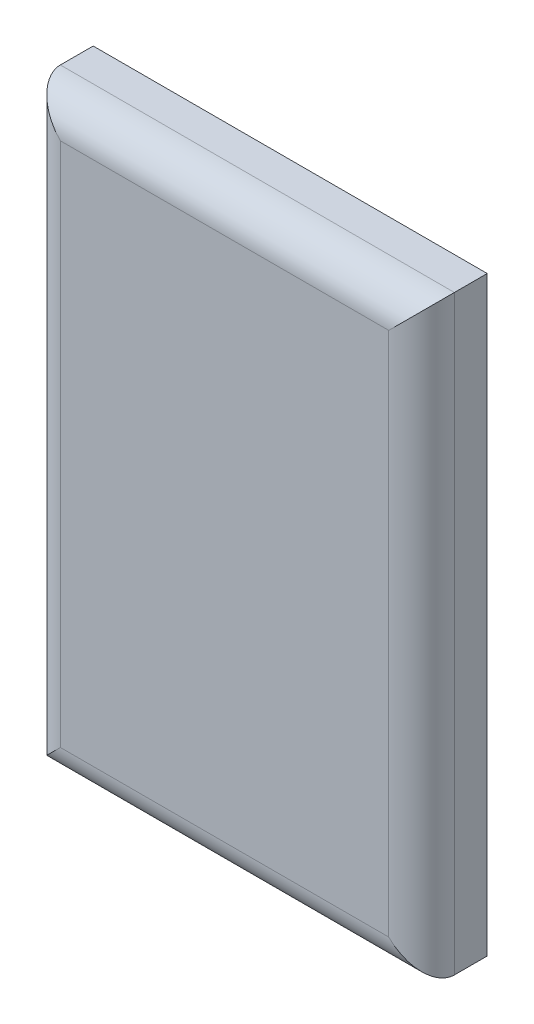
ISO-10303-21;
HEADER;
FILE_DESCRIPTION(('STEP AP214'),'2;1');
FILE_NAME('part.step','',(''),(''),'','','');
FILE_SCHEMA(('AUTOMOTIVE_DESIGN { 1 0 10303 214 1 1 1 1 }'));
ENDSEC;
DATA;
#1=APPLICATION_CONTEXT('core data for automotive mechanical design processes');
#2=APPLICATION_PROTOCOL_DEFINITION('international standard','automotive_design',2000,#1);
#3=PRODUCT_CONTEXT('',#1,'mechanical');
#4=PRODUCT('Part','Part','',(#3));
#5=PRODUCT_RELATED_PRODUCT_CATEGORY('part','',(#4));
#6=PRODUCT_DEFINITION_FORMATION('','',#4);
#7=PRODUCT_DEFINITION_CONTEXT('part definition',#1,'design');
#8=PRODUCT_DEFINITION('design','',#6,#7);
#9=PRODUCT_DEFINITION_SHAPE('','',#8);
#10=(LENGTH_UNIT() NAMED_UNIT(*) SI_UNIT(.MILLI.,.METRE.));
#11=(NAMED_UNIT(*) PLANE_ANGLE_UNIT() SI_UNIT($,.RADIAN.));
#12=(NAMED_UNIT(*) SI_UNIT($,.STERADIAN.) SOLID_ANGLE_UNIT());
#13=UNCERTAINTY_MEASURE_WITH_UNIT(LENGTH_MEASURE(1.E-05),#10,'distance_accuracy_value','');
#14=(GEOMETRIC_REPRESENTATION_CONTEXT(3) GLOBAL_UNCERTAINTY_ASSIGNED_CONTEXT((#13)) GLOBAL_UNIT_ASSIGNED_CONTEXT((#10,
#11,#12)) REPRESENTATION_CONTEXT('',''));
#15=CARTESIAN_POINT('',(0.,0.,0.));
#16=DIRECTION('',(0.,0.,1.));
#17=DIRECTION('',(1.,0.,0.));
#18=AXIS2_PLACEMENT_3D('',#15,#16,#17);
#19=CARTESIAN_POINT('',(76.2,-114.3,25.4));
#20=DIRECTION('',(-1.,0.,0.));
#21=DIRECTION('',(0.,0.,1.));
#22=AXIS2_PLACEMENT_3D('',#19,#20,#21);
#23=PLANE('',#22);
#24=DIRECTION('',(0.,0.,-1.));
#25=VECTOR('',#24,1.);
#26=CARTESIAN_POINT('',(76.2,114.3,25.4));
#27=LINE('',#26,#25);
#28=CARTESIAN_POINT('',(76.2,114.3,12.7));
#29=VERTEX_POINT('',#28);
#30=CARTESIAN_POINT('',(76.2,114.3,0.));
#31=VERTEX_POINT('',#30);
#32=EDGE_CURVE('E91',#29,#31,#27,.T.);
#33=ORIENTED_EDGE('',*,*,#32,.F.);
#34=DIRECTION('',(0.,1.,0.));
#35=VECTOR('',#34,1.);
#36=CARTESIAN_POINT('',(76.2,-114.3,12.7));
#37=LINE('',#36,#35);
#38=CARTESIAN_POINT('',(76.2,-114.3,12.7));
#39=VERTEX_POINT('',#38);
#40=EDGE_CURVE('E11',#29,#39,#37,.F.);
#41=ORIENTED_EDGE('',*,*,#40,.T.);
#42=DIRECTION('',(0.,0.,-1.));
#43=VECTOR('',#42,1.);
#44=CARTESIAN_POINT('',(76.2,-114.3,25.4));
#45=LINE('',#44,#43);
#46=CARTESIAN_POINT('',(76.2,-114.3,0.));
#47=VERTEX_POINT('',#46);
#48=EDGE_CURVE('E111',#39,#47,#45,.T.);
#49=ORIENTED_EDGE('',*,*,#48,.T.);
#50=DIRECTION('',(0.,1.,0.));
#51=VECTOR('',#50,1.);
#52=CARTESIAN_POINT('',(76.2,-114.3,0.));
#53=LINE('',#52,#51);
#54=EDGE_CURVE('E106',#47,#31,#53,.T.);
#55=ORIENTED_EDGE('',*,*,#54,.T.);
#56=EDGE_LOOP('',(#33,#41,#49,#55));
#57=FACE_BOUND('',#56,.T.);
#58=ADVANCED_FACE('F39',(#57),#23,.F.);
#59=CARTESIAN_POINT('',(-76.2,114.3,25.4));
#60=DIRECTION('',(0.,-1.,0.));
#61=DIRECTION('',(0.,0.,-1.));
#62=AXIS2_PLACEMENT_3D('',#59,#60,#61);
#63=PLANE('',#62);
#64=DIRECTION('',(0.,0.,-1.));
#65=VECTOR('',#64,1.);
#66=CARTESIAN_POINT('',(-76.2,114.3,25.4));
#67=LINE('',#66,#65);
#68=CARTESIAN_POINT('',(-76.2,114.3,12.7));
#69=VERTEX_POINT('',#68);
#70=CARTESIAN_POINT('',(-76.2,114.3,0.));
#71=VERTEX_POINT('',#70);
#72=EDGE_CURVE('E100',#69,#71,#67,.T.);
#73=ORIENTED_EDGE('',*,*,#72,.F.);
#74=DIRECTION('',(-1.,0.,0.));
#75=VECTOR('',#74,1.);
#76=CARTESIAN_POINT('',(-76.2,114.3,12.7));
#77=LINE('',#76,#75);
#78=EDGE_CURVE('E48',#69,#29,#77,.F.);
#79=ORIENTED_EDGE('',*,*,#78,.T.);
#80=ORIENTED_EDGE('',*,*,#32,.T.);
#81=DIRECTION('',(-1.,0.,0.));
#82=VECTOR('',#81,1.);
#83=CARTESIAN_POINT('',(-76.2,114.3,0.));
#84=LINE('',#83,#82);
#85=EDGE_CURVE('E94',#31,#71,#84,.T.);
#86=ORIENTED_EDGE('',*,*,#85,.T.);
#87=EDGE_LOOP('',(#73,#79,#80,#86));
#88=FACE_BOUND('',#87,.T.);
#89=ADVANCED_FACE('F93',(#88),#63,.F.);
#90=CARTESIAN_POINT('',(-76.2,-114.3,25.4));
#91=DIRECTION('',(1.,0.,0.));
#92=DIRECTION('',(0.,0.,-1.));
#93=AXIS2_PLACEMENT_3D('',#90,#91,#92);
#94=PLANE('',#93);
#95=DIRECTION('',(0.,0.,-1.));
#96=VECTOR('',#95,1.);
#97=CARTESIAN_POINT('',(-76.2,-114.3,25.4));
#98=LINE('',#97,#96);
#99=CARTESIAN_POINT('',(-76.2,-114.3,12.7));
#100=VERTEX_POINT('',#99);
#101=CARTESIAN_POINT('',(-76.2,-114.3,0.));
#102=VERTEX_POINT('',#101);
#103=EDGE_CURVE('E121',#100,#102,#98,.T.);
#104=ORIENTED_EDGE('',*,*,#103,.F.);
#105=DIRECTION('',(0.,-1.,0.));
#106=VECTOR('',#105,1.);
#107=CARTESIAN_POINT('',(-76.2,-114.3,12.7));
#108=LINE('',#107,#106);
#109=EDGE_CURVE('E63',#100,#69,#108,.F.);
#110=ORIENTED_EDGE('',*,*,#109,.T.);
#111=ORIENTED_EDGE('',*,*,#72,.T.);
#112=DIRECTION('',(0.,-1.,0.));
#113=VECTOR('',#112,1.);
#114=CARTESIAN_POINT('',(-76.2,-114.3,0.));
#115=LINE('',#114,#113);
#116=EDGE_CURVE('E108',#71,#102,#115,.T.);
#117=ORIENTED_EDGE('',*,*,#116,.T.);
#118=EDGE_LOOP('',(#104,#110,#111,#117));
#119=FACE_BOUND('',#118,.T.);
#120=ADVANCED_FACE('F159',(#119),#94,.F.);
#121=CARTESIAN_POINT('',(-76.2,-114.3,25.4));
#122=DIRECTION('',(0.,1.,0.));
#123=DIRECTION('',(0.,0.,1.));
#124=AXIS2_PLACEMENT_3D('',#121,#122,#123);
#125=PLANE('',#124);
#126=ORIENTED_EDGE('',*,*,#48,.F.);
#127=DIRECTION('',(1.,0.,0.));
#128=VECTOR('',#127,1.);
#129=CARTESIAN_POINT('',(-76.2,-114.3,12.7));
#130=LINE('',#129,#128);
#131=EDGE_CURVE('E132',#39,#100,#130,.F.);
#132=ORIENTED_EDGE('',*,*,#131,.T.);
#133=ORIENTED_EDGE('',*,*,#103,.T.);
#134=DIRECTION('',(1.,0.,0.));
#135=VECTOR('',#134,1.);
#136=CARTESIAN_POINT('',(-76.2,-114.3,0.));
#137=LINE('',#136,#135);
#138=EDGE_CURVE('E118',#102,#47,#137,.T.);
#139=ORIENTED_EDGE('',*,*,#138,.T.);
#140=EDGE_LOOP('',(#126,#132,#133,#139));
#141=FACE_BOUND('',#140,.T.);
#142=ADVANCED_FACE('F158',(#141),#125,.F.);
#143=CARTESIAN_POINT('',(0.,0.,25.4));
#144=DIRECTION('',(0.,0.,-1.));
#145=DIRECTION('',(-1.,0.,0.));
#146=AXIS2_PLACEMENT_3D('',#143,#144,#145);
#147=PLANE('',#146);
#148=DIRECTION('',(0.,-1.,0.));
#149=VECTOR('',#148,1.);
#150=CARTESIAN_POINT('',(-63.5,0.,25.4));
#151=LINE('',#150,#149);
#152=CARTESIAN_POINT('',(-63.5,101.6,25.4));
#153=VERTEX_POINT('',#152);
#154=CARTESIAN_POINT('',(-63.5,-101.6,25.4));
#155=VERTEX_POINT('',#154);
#156=EDGE_CURVE('E127',#153,#155,#151,.T.);
#157=ORIENTED_EDGE('',*,*,#156,.T.);
#158=DIRECTION('',(1.,0.,0.));
#159=VECTOR('',#158,1.);
#160=CARTESIAN_POINT('',(0.,-101.6,25.4));
#161=LINE('',#160,#159);
#162=CARTESIAN_POINT('',(63.5,-101.6,25.4));
#163=VERTEX_POINT('',#162);
#164=EDGE_CURVE('E129',#155,#163,#161,.T.);
#165=ORIENTED_EDGE('',*,*,#164,.T.);
#166=DIRECTION('',(0.,1.,0.));
#167=VECTOR('',#166,1.);
#168=CARTESIAN_POINT('',(63.5,0.,25.4));
#169=LINE('',#168,#167);
#170=CARTESIAN_POINT('',(63.5,101.6,25.4));
#171=VERTEX_POINT('',#170);
#172=EDGE_CURVE('E99',#163,#171,#169,.T.);
#173=ORIENTED_EDGE('',*,*,#172,.T.);
#174=DIRECTION('',(-1.,0.,0.));
#175=VECTOR('',#174,1.);
#176=CARTESIAN_POINT('',(0.,101.6,25.4));
#177=LINE('',#176,#175);
#178=EDGE_CURVE('E125',#171,#153,#177,.T.);
#179=ORIENTED_EDGE('',*,*,#178,.T.);
#180=EDGE_LOOP('',(#157,#165,#173,#179));
#181=FACE_BOUND('',#180,.T.);
#182=ADVANCED_FACE('F151',(#181),#147,.F.);
#183=CARTESIAN_POINT('',(0.,0.,0.));
#184=DIRECTION('',(0.,0.,-1.));
#185=DIRECTION('',(-1.,0.,0.));
#186=AXIS2_PLACEMENT_3D('',#183,#184,#185);
#187=PLANE('',#186);
#188=ORIENTED_EDGE('',*,*,#54,.F.);
#189=ORIENTED_EDGE('',*,*,#138,.F.);
#190=ORIENTED_EDGE('',*,*,#116,.F.);
#191=ORIENTED_EDGE('',*,*,#85,.F.);
#192=EDGE_LOOP('',(#188,#189,#190,#191));
#193=FACE_BOUND('',#192,.T.);
#194=ADVANCED_FACE('F104',(#193),#187,.T.);
#195=CARTESIAN_POINT('',(0.,101.6,12.7));
#196=DIRECTION('',(-1.,0.,0.));
#197=DIRECTION('',(0.,0.,1.));
#198=AXIS2_PLACEMENT_3D('',#195,#196,#197);
#199=CYLINDRICAL_SURFACE('',#198,12.7);
#200=CARTESIAN_POINT('',(63.5,101.6,12.7));
#201=DIRECTION('',(-0.707106781186547,0.707106781186547,0.));
#202=DIRECTION('',(0.707106781186547,0.707106781186547,0.));
#203=AXIS2_PLACEMENT_3D('',#200,#201,#202);
#204=ELLIPSE('',#203,17.9605122421383,12.7);
#205=EDGE_CURVE('E115',#29,#171,#204,.F.);
#206=ORIENTED_EDGE('',*,*,#205,.F.);
#207=ORIENTED_EDGE('',*,*,#78,.F.);
#208=CARTESIAN_POINT('',(-63.5,101.6,12.7));
#209=DIRECTION('',(-0.707106781186547,-0.707106781186547,0.));
#210=DIRECTION('',(-0.707106781186547,0.707106781186547,0.));
#211=AXIS2_PLACEMENT_3D('',#208,#209,#210);
#212=ELLIPSE('',#211,17.9605122421383,12.7);
#213=EDGE_CURVE('E43',#153,#69,#212,.T.);
#214=ORIENTED_EDGE('',*,*,#213,.F.);
#215=ORIENTED_EDGE('',*,*,#178,.F.);
#216=EDGE_LOOP('',(#206,#207,#214,#215));
#217=FACE_BOUND('',#216,.T.);
#218=ADVANCED_FACE('F41',(#217),#199,.T.);
#219=CARTESIAN_POINT('',(-63.5,0.,12.7));
#220=DIRECTION('',(0.,-1.,0.));
#221=DIRECTION('',(0.,0.,-1.));
#222=AXIS2_PLACEMENT_3D('',#219,#220,#221);
#223=CYLINDRICAL_SURFACE('',#222,12.7);
#224=ORIENTED_EDGE('',*,*,#213,.T.);
#225=ORIENTED_EDGE('',*,*,#109,.F.);
#226=CARTESIAN_POINT('',(-63.5,-101.6,12.7));
#227=DIRECTION('',(0.707106781186547,-0.707106781186547,0.));
#228=DIRECTION('',(-0.707106781186547,-0.707106781186547,0.));
#229=AXIS2_PLACEMENT_3D('',#226,#227,#228);
#230=ELLIPSE('',#229,17.9605122421383,12.7);
#231=EDGE_CURVE('E139',#155,#100,#230,.T.);
#232=ORIENTED_EDGE('',*,*,#231,.F.);
#233=ORIENTED_EDGE('',*,*,#156,.F.);
#234=EDGE_LOOP('',(#224,#225,#232,#233));
#235=FACE_BOUND('',#234,.T.);
#236=ADVANCED_FACE('F177',(#235),#223,.T.);
#237=CARTESIAN_POINT('',(63.5,0.,12.7));
#238=DIRECTION('',(0.,1.,0.));
#239=DIRECTION('',(0.,0.,1.));
#240=AXIS2_PLACEMENT_3D('',#237,#238,#239);
#241=CYLINDRICAL_SURFACE('',#240,12.7);
#242=ORIENTED_EDGE('',*,*,#205,.T.);
#243=ORIENTED_EDGE('',*,*,#172,.F.);
#244=CARTESIAN_POINT('',(63.5,-101.6,12.7));
#245=DIRECTION('',(0.707106781186547,0.707106781186547,0.));
#246=DIRECTION('',(-0.707106781186547,0.707106781186547,0.));
#247=AXIS2_PLACEMENT_3D('',#244,#245,#246);
#248=ELLIPSE('',#247,17.9605122421383,12.7);
#249=EDGE_CURVE('E137',#39,#163,#248,.F.);
#250=ORIENTED_EDGE('',*,*,#249,.F.);
#251=ORIENTED_EDGE('',*,*,#40,.F.);
#252=EDGE_LOOP('',(#242,#243,#250,#251));
#253=FACE_BOUND('',#252,.T.);
#254=ADVANCED_FACE('F144',(#253),#241,.T.);
#255=CARTESIAN_POINT('',(0.,-101.6,12.7));
#256=DIRECTION('',(1.,0.,0.));
#257=DIRECTION('',(0.,0.,-1.));
#258=AXIS2_PLACEMENT_3D('',#255,#256,#257);
#259=CYLINDRICAL_SURFACE('',#258,12.7);
#260=ORIENTED_EDGE('',*,*,#231,.T.);
#261=ORIENTED_EDGE('',*,*,#131,.F.);
#262=ORIENTED_EDGE('',*,*,#249,.T.);
#263=ORIENTED_EDGE('',*,*,#164,.F.);
#264=EDGE_LOOP('',(#260,#261,#262,#263));
#265=FACE_BOUND('',#264,.T.);
#266=ADVANCED_FACE('F155',(#265),#259,.T.);
#267=CLOSED_SHELL('',(#58,#89,#120,#142,#182,#194,#218,#236,#254,#266));
#268=MANIFOLD_SOLID_BREP('B2',#267);
#269=ADVANCED_BREP_SHAPE_REPRESENTATION('',(#18,#268),#14);
#270=SHAPE_DEFINITION_REPRESENTATION(#9,#269);
ENDSEC;
END-ISO-10303-21;
